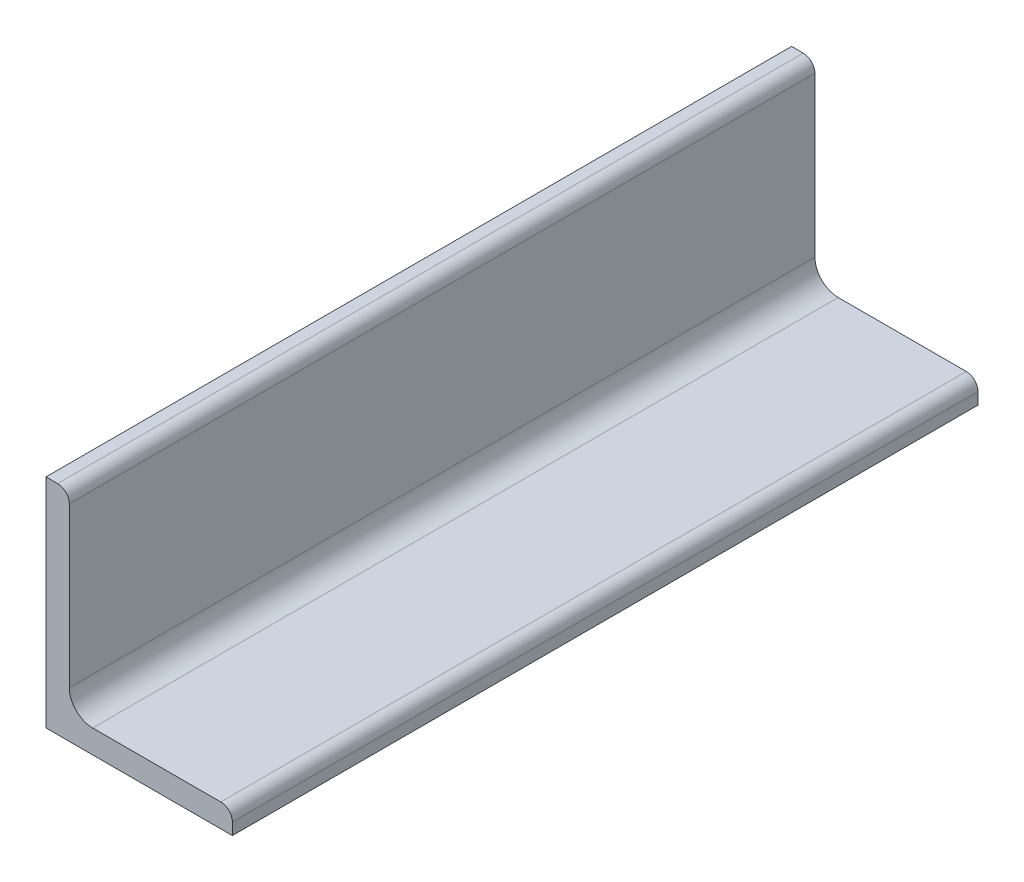
ISO-10303-21;
HEADER;
FILE_DESCRIPTION(('STEP AP214'),'2;1');
FILE_NAME('part.step','',(''),(''),'','','');
FILE_SCHEMA(('AUTOMOTIVE_DESIGN { 1 0 10303 214 1 1 1 1 }'));
ENDSEC;
DATA;
#1=APPLICATION_CONTEXT('core data for automotive mechanical design processes');
#2=APPLICATION_PROTOCOL_DEFINITION('international standard','automotive_design',2000,#1);
#3=PRODUCT_CONTEXT('',#1,'mechanical');
#4=PRODUCT('Part','Part','',(#3));
#5=PRODUCT_RELATED_PRODUCT_CATEGORY('part','',(#4));
#6=PRODUCT_DEFINITION_FORMATION('','',#4);
#7=PRODUCT_DEFINITION_CONTEXT('part definition',#1,'design');
#8=PRODUCT_DEFINITION('design','',#6,#7);
#9=PRODUCT_DEFINITION_SHAPE('','',#8);
#10=(LENGTH_UNIT() NAMED_UNIT(*) SI_UNIT(.MILLI.,.METRE.));
#11=(NAMED_UNIT(*) PLANE_ANGLE_UNIT() SI_UNIT($,.RADIAN.));
#12=(NAMED_UNIT(*) SI_UNIT($,.STERADIAN.) SOLID_ANGLE_UNIT());
#13=UNCERTAINTY_MEASURE_WITH_UNIT(LENGTH_MEASURE(1.E-05),#10,'distance_accuracy_value','');
#14=(GEOMETRIC_REPRESENTATION_CONTEXT(3) GLOBAL_UNCERTAINTY_ASSIGNED_CONTEXT((#13)) GLOBAL_UNIT_ASSIGNED_CONTEXT((#10,
#11,#12)) REPRESENTATION_CONTEXT('',''));
#15=CARTESIAN_POINT('',(0.,0.,0.));
#16=DIRECTION('',(0.,0.,1.));
#17=DIRECTION('',(1.,0.,0.));
#18=AXIS2_PLACEMENT_3D('',#15,#16,#17);
#19=CARTESIAN_POINT('',(0.490776827053332,89.7372005393545,304.8));
#20=DIRECTION('',(1.,0.,0.));
#21=DIRECTION('',(0.,0.,-1.));
#22=AXIS2_PLACEMENT_3D('',#19,#20,#21);
#23=PLANE('',#22);
#24=DIRECTION('',(0.,-1.,0.));
#25=VECTOR('',#24,1.);
#26=CARTESIAN_POINT('',(0.490776827053332,89.7372005393545,0.));
#27=LINE('',#26,#25);
#28=CARTESIAN_POINT('',(0.490776827053332,89.7372005393545,0.));
#29=VERTEX_POINT('',#28);
#30=CARTESIAN_POINT('',(0.490776827053332,0.837200539354535,0.));
#31=VERTEX_POINT('',#30);
#32=EDGE_CURVE('E135',#29,#31,#27,.T.);
#33=ORIENTED_EDGE('',*,*,#32,.T.);
#34=DIRECTION('',(0.,0.,-1.));
#35=VECTOR('',#34,1.);
#36=CARTESIAN_POINT('',(0.490776827053332,0.837200539354535,304.8));
#37=LINE('',#36,#35);
#38=CARTESIAN_POINT('',(0.490776827053332,0.837200539354535,304.8));
#39=VERTEX_POINT('',#38);
#40=EDGE_CURVE('E11',#39,#31,#37,.T.);
#41=ORIENTED_EDGE('',*,*,#40,.F.);
#42=DIRECTION('',(0.,-1.,0.));
#43=VECTOR('',#42,1.);
#44=CARTESIAN_POINT('',(0.490776827053332,89.7372005393545,304.8));
#45=LINE('',#44,#43);
#46=CARTESIAN_POINT('',(0.490776827053332,89.7372005393545,304.8));
#47=VERTEX_POINT('',#46);
#48=EDGE_CURVE('E151',#47,#39,#45,.T.);
#49=ORIENTED_EDGE('',*,*,#48,.F.);
#50=DIRECTION('',(0.,0.,-1.));
#51=VECTOR('',#50,1.);
#52=CARTESIAN_POINT('',(0.490776827053332,89.7372005393545,304.8));
#53=LINE('',#52,#51);
#54=EDGE_CURVE('E131',#47,#29,#53,.T.);
#55=ORIENTED_EDGE('',*,*,#54,.T.);
#56=EDGE_LOOP('',(#33,#41,#49,#55));
#57=FACE_BOUND('',#56,.T.);
#58=ADVANCED_FACE('F33',(#57),#23,.F.);
#59=CARTESIAN_POINT('',(0.490776827053332,0.837200539354535,304.8));
#60=DIRECTION('',(0.,1.,0.));
#61=DIRECTION('',(0.,0.,1.));
#62=AXIS2_PLACEMENT_3D('',#59,#60,#61);
#63=PLANE('',#62);
#64=DIRECTION('',(1.,0.,0.));
#65=VECTOR('',#64,1.);
#66=CARTESIAN_POINT('',(0.490776827053332,0.837200539354535,0.));
#67=LINE('',#66,#65);
#68=CARTESIAN_POINT('',(76.6907768270533,0.837200539354535,0.));
#69=VERTEX_POINT('',#68);
#70=EDGE_CURVE('E138',#31,#69,#67,.T.);
#71=ORIENTED_EDGE('',*,*,#70,.T.);
#72=DIRECTION('',(0.,0.,-1.));
#73=VECTOR('',#72,1.);
#74=CARTESIAN_POINT('',(76.6907768270533,0.837200539354535,304.8));
#75=LINE('',#74,#73);
#76=CARTESIAN_POINT('',(76.6907768270533,0.837200539354535,304.8));
#77=VERTEX_POINT('',#76);
#78=EDGE_CURVE('E41',#77,#69,#75,.T.);
#79=ORIENTED_EDGE('',*,*,#78,.F.);
#80=DIRECTION('',(1.,0.,0.));
#81=VECTOR('',#80,1.);
#82=CARTESIAN_POINT('',(0.490776827053332,0.837200539354535,304.8));
#83=LINE('',#82,#81);
#84=EDGE_CURVE('E95',#39,#77,#83,.T.);
#85=ORIENTED_EDGE('',*,*,#84,.F.);
#86=ORIENTED_EDGE('',*,*,#40,.T.);
#87=EDGE_LOOP('',(#71,#79,#85,#86));
#88=FACE_BOUND('',#87,.T.);
#89=ADVANCED_FACE('F194',(#88),#63,.F.);
#90=CARTESIAN_POINT('',(76.6907768270533,0.837200539354535,304.8));
#91=DIRECTION('',(-1.,0.,0.));
#92=DIRECTION('',(0.,0.,1.));
#93=AXIS2_PLACEMENT_3D('',#90,#91,#92);
#94=PLANE('',#93);
#95=DIRECTION('',(0.,1.,0.));
#96=VECTOR('',#95,1.);
#97=CARTESIAN_POINT('',(76.6907768270533,0.837200539354535,0.));
#98=LINE('',#97,#96);
#99=CARTESIAN_POINT('',(76.6907768270533,5.59970053935453,0.));
#100=VERTEX_POINT('',#99);
#101=EDGE_CURVE('E140',#69,#100,#98,.T.);
#102=ORIENTED_EDGE('',*,*,#101,.T.);
#103=DIRECTION('',(0.,0.,-1.));
#104=VECTOR('',#103,1.);
#105=CARTESIAN_POINT('',(76.6907768270533,5.59970053935453,304.8));
#106=LINE('',#105,#104);
#107=CARTESIAN_POINT('',(76.6907768270533,5.59970053935453,304.8));
#108=VERTEX_POINT('',#107);
#109=EDGE_CURVE('E161',#108,#100,#106,.T.);
#110=ORIENTED_EDGE('',*,*,#109,.F.);
#111=DIRECTION('',(0.,1.,0.));
#112=VECTOR('',#111,1.);
#113=CARTESIAN_POINT('',(76.6907768270533,0.837200539354535,304.8));
#114=LINE('',#113,#112);
#115=EDGE_CURVE('E169',#77,#108,#114,.T.);
#116=ORIENTED_EDGE('',*,*,#115,.F.);
#117=ORIENTED_EDGE('',*,*,#78,.T.);
#118=EDGE_LOOP('',(#102,#110,#116,#117));
#119=FACE_BOUND('',#118,.T.);
#120=ADVANCED_FACE('F167',(#119),#94,.F.);
#121=CARTESIAN_POINT('',(71.9282768270533,5.59970053935453,304.8));
#122=DIRECTION('',(0.,0.,-1.));
#123=DIRECTION('',(-1.,0.,0.));
#124=AXIS2_PLACEMENT_3D('',#121,#122,#123);
#125=CYLINDRICAL_SURFACE('',#124,4.7625);
#126=CARTESIAN_POINT('',(71.9282768270533,5.59970053935453,0.));
#127=DIRECTION('',(0.,0.,1.));
#128=DIRECTION('',(1.,0.,0.));
#129=AXIS2_PLACEMENT_3D('',#126,#127,#128);
#130=CIRCLE('',#129,4.7625);
#131=CARTESIAN_POINT('',(71.9282768270533,10.3622005393545,0.));
#132=VERTEX_POINT('',#131);
#133=EDGE_CURVE('E142',#100,#132,#130,.T.);
#134=ORIENTED_EDGE('',*,*,#133,.T.);
#135=DIRECTION('',(0.,0.,-1.));
#136=VECTOR('',#135,1.);
#137=CARTESIAN_POINT('',(71.9282768270533,10.3622005393545,304.8));
#138=LINE('',#137,#136);
#139=CARTESIAN_POINT('',(71.9282768270533,10.3622005393545,304.8));
#140=VERTEX_POINT('',#139);
#141=EDGE_CURVE('E158',#140,#132,#138,.T.);
#142=ORIENTED_EDGE('',*,*,#141,.F.);
#143=CARTESIAN_POINT('',(71.9282768270533,5.59970053935453,304.8));
#144=DIRECTION('',(0.,0.,1.));
#145=DIRECTION('',(1.,0.,0.));
#146=AXIS2_PLACEMENT_3D('',#143,#144,#145);
#147=CIRCLE('',#146,4.7625);
#148=EDGE_CURVE('E185',#108,#140,#147,.T.);
#149=ORIENTED_EDGE('',*,*,#148,.F.);
#150=ORIENTED_EDGE('',*,*,#109,.T.);
#151=EDGE_LOOP('',(#134,#142,#149,#150));
#152=FACE_BOUND('',#151,.T.);
#153=ADVANCED_FACE('F178',(#152),#125,.T.);
#154=CARTESIAN_POINT('',(71.9282768270533,10.3622005393545,304.8));
#155=DIRECTION('',(0.,-1.,0.));
#156=DIRECTION('',(0.,0.,-1.));
#157=AXIS2_PLACEMENT_3D('',#154,#155,#156);
#158=PLANE('',#157);
#159=DIRECTION('',(-1.,0.,0.));
#160=VECTOR('',#159,1.);
#161=CARTESIAN_POINT('',(71.9282768270533,10.3622005393545,0.));
#162=LINE('',#161,#160);
#163=CARTESIAN_POINT('',(19.5407768270533,10.3622005393545,0.));
#164=VERTEX_POINT('',#163);
#165=EDGE_CURVE('E144',#132,#164,#162,.T.);
#166=ORIENTED_EDGE('',*,*,#165,.T.);
#167=DIRECTION('',(0.,0.,-1.));
#168=VECTOR('',#167,1.);
#169=CARTESIAN_POINT('',(19.5407768270533,10.3622005393545,304.8));
#170=LINE('',#169,#168);
#171=CARTESIAN_POINT('',(19.5407768270533,10.3622005393545,304.8));
#172=VERTEX_POINT('',#171);
#173=EDGE_CURVE('E155',#172,#164,#170,.T.);
#174=ORIENTED_EDGE('',*,*,#173,.F.);
#175=DIRECTION('',(-1.,0.,0.));
#176=VECTOR('',#175,1.);
#177=CARTESIAN_POINT('',(71.9282768270533,10.3622005393545,304.8));
#178=LINE('',#177,#176);
#179=EDGE_CURVE('E184',#140,#172,#178,.T.);
#180=ORIENTED_EDGE('',*,*,#179,.F.);
#181=ORIENTED_EDGE('',*,*,#141,.T.);
#182=EDGE_LOOP('',(#166,#174,#180,#181));
#183=FACE_BOUND('',#182,.T.);
#184=ADVANCED_FACE('F182',(#183),#158,.F.);
#185=CARTESIAN_POINT('',(19.5407768270533,19.8872005393545,304.8));
#186=DIRECTION('',(0.,0.,-1.));
#187=DIRECTION('',(-1.,0.,0.));
#188=AXIS2_PLACEMENT_3D('',#185,#186,#187);
#189=CYLINDRICAL_SURFACE('',#188,9.52499999999999);
#190=CARTESIAN_POINT('',(19.5407768270533,19.8872005393545,0.));
#191=DIRECTION('',(0.,0.,-1.));
#192=DIRECTION('',(1.,0.,0.));
#193=AXIS2_PLACEMENT_3D('',#190,#191,#192);
#194=CIRCLE('',#193,9.52499999999999);
#195=CARTESIAN_POINT('',(10.0157768270533,19.8872005393545,0.));
#196=VERTEX_POINT('',#195);
#197=EDGE_CURVE('E146',#164,#196,#194,.T.);
#198=ORIENTED_EDGE('',*,*,#197,.T.);
#199=DIRECTION('',(0.,0.,-1.));
#200=VECTOR('',#199,1.);
#201=CARTESIAN_POINT('',(10.0157768270533,19.8872005393545,304.8));
#202=LINE('',#201,#200);
#203=CARTESIAN_POINT('',(10.0157768270533,19.8872005393545,304.8));
#204=VERTEX_POINT('',#203);
#205=EDGE_CURVE('E126',#204,#196,#202,.T.);
#206=ORIENTED_EDGE('',*,*,#205,.F.);
#207=CARTESIAN_POINT('',(19.5407768270533,19.8872005393545,304.8));
#208=DIRECTION('',(0.,0.,-1.));
#209=DIRECTION('',(1.,0.,0.));
#210=AXIS2_PLACEMENT_3D('',#207,#208,#209);
#211=CIRCLE('',#210,9.52499999999999);
#212=EDGE_CURVE('E117',#172,#204,#211,.T.);
#213=ORIENTED_EDGE('',*,*,#212,.F.);
#214=ORIENTED_EDGE('',*,*,#173,.T.);
#215=EDGE_LOOP('',(#198,#206,#213,#214));
#216=FACE_BOUND('',#215,.T.);
#217=ADVANCED_FACE('F206',(#216),#189,.F.);
#218=CARTESIAN_POINT('',(10.0157768270533,19.8872005393545,304.8));
#219=DIRECTION('',(-1.,0.,0.));
#220=DIRECTION('',(0.,0.,1.));
#221=AXIS2_PLACEMENT_3D('',#218,#219,#220);
#222=PLANE('',#221);
#223=DIRECTION('',(0.,1.,0.));
#224=VECTOR('',#223,1.);
#225=CARTESIAN_POINT('',(10.0157768270533,19.8872005393545,0.));
#226=LINE('',#225,#224);
#227=CARTESIAN_POINT('',(10.0157768270533,84.9747005393545,0.));
#228=VERTEX_POINT('',#227);
#229=EDGE_CURVE('E125',#196,#228,#226,.T.);
#230=ORIENTED_EDGE('',*,*,#229,.T.);
#231=DIRECTION('',(0.,0.,-1.));
#232=VECTOR('',#231,1.);
#233=CARTESIAN_POINT('',(10.0157768270533,84.9747005393545,304.8));
#234=LINE('',#233,#232);
#235=CARTESIAN_POINT('',(10.0157768270533,84.9747005393545,304.8));
#236=VERTEX_POINT('',#235);
#237=EDGE_CURVE('E122',#236,#228,#234,.T.);
#238=ORIENTED_EDGE('',*,*,#237,.F.);
#239=DIRECTION('',(0.,1.,0.));
#240=VECTOR('',#239,1.);
#241=CARTESIAN_POINT('',(10.0157768270533,19.8872005393545,304.8));
#242=LINE('',#241,#240);
#243=EDGE_CURVE('E111',#204,#236,#242,.T.);
#244=ORIENTED_EDGE('',*,*,#243,.F.);
#245=ORIENTED_EDGE('',*,*,#205,.T.);
#246=EDGE_LOOP('',(#230,#238,#244,#245));
#247=FACE_BOUND('',#246,.T.);
#248=ADVANCED_FACE('F123',(#247),#222,.F.);
#249=CARTESIAN_POINT('',(5.25327682705333,84.9747005393545,304.8));
#250=DIRECTION('',(0.,0.,-1.));
#251=DIRECTION('',(-1.,0.,0.));
#252=AXIS2_PLACEMENT_3D('',#249,#250,#251);
#253=CYLINDRICAL_SURFACE('',#252,4.7625);
#254=CARTESIAN_POINT('',(5.25327682705333,84.9747005393545,0.));
#255=DIRECTION('',(0.,0.,1.));
#256=DIRECTION('',(1.,0.,0.));
#257=AXIS2_PLACEMENT_3D('',#254,#255,#256);
#258=CIRCLE('',#257,4.7625);
#259=CARTESIAN_POINT('',(5.25327682705333,89.7372005393545,0.));
#260=VERTEX_POINT('',#259);
#261=EDGE_CURVE('E81',#228,#260,#258,.T.);
#262=ORIENTED_EDGE('',*,*,#261,.T.);
#263=DIRECTION('',(0.,0.,-1.));
#264=VECTOR('',#263,1.);
#265=CARTESIAN_POINT('',(5.25327682705333,89.7372005393545,304.8));
#266=LINE('',#265,#264);
#267=CARTESIAN_POINT('',(5.25327682705333,89.7372005393545,304.8));
#268=VERTEX_POINT('',#267);
#269=EDGE_CURVE('E127',#268,#260,#266,.T.);
#270=ORIENTED_EDGE('',*,*,#269,.F.);
#271=CARTESIAN_POINT('',(5.25327682705333,84.9747005393545,304.8));
#272=DIRECTION('',(0.,0.,1.));
#273=DIRECTION('',(1.,0.,0.));
#274=AXIS2_PLACEMENT_3D('',#271,#272,#273);
#275=CIRCLE('',#274,4.7625);
#276=EDGE_CURVE('E115',#236,#268,#275,.T.);
#277=ORIENTED_EDGE('',*,*,#276,.F.);
#278=ORIENTED_EDGE('',*,*,#237,.T.);
#279=EDGE_LOOP('',(#262,#270,#277,#278));
#280=FACE_BOUND('',#279,.T.);
#281=ADVANCED_FACE('F129',(#280),#253,.T.);
#282=CARTESIAN_POINT('',(5.25327682705333,89.7372005393545,304.8));
#283=DIRECTION('',(0.,-1.,0.));
#284=DIRECTION('',(0.,0.,-1.));
#285=AXIS2_PLACEMENT_3D('',#282,#283,#284);
#286=PLANE('',#285);
#287=DIRECTION('',(-1.,0.,0.));
#288=VECTOR('',#287,1.);
#289=CARTESIAN_POINT('',(5.25327682705333,89.7372005393545,0.));
#290=LINE('',#289,#288);
#291=EDGE_CURVE('E87',#260,#29,#290,.T.);
#292=ORIENTED_EDGE('',*,*,#291,.T.);
#293=ORIENTED_EDGE('',*,*,#54,.F.);
#294=DIRECTION('',(-1.,0.,0.));
#295=VECTOR('',#294,1.);
#296=CARTESIAN_POINT('',(5.25327682705333,89.7372005393545,304.8));
#297=LINE('',#296,#295);
#298=EDGE_CURVE('E49',#268,#47,#297,.T.);
#299=ORIENTED_EDGE('',*,*,#298,.F.);
#300=ORIENTED_EDGE('',*,*,#269,.T.);
#301=EDGE_LOOP('',(#292,#293,#299,#300));
#302=FACE_BOUND('',#301,.T.);
#303=ADVANCED_FACE('F214',(#302),#286,.F.);
#304=CARTESIAN_POINT('',(71.9282768270533,5.59970053935453,304.8));
#305=DIRECTION('',(0.,0.,1.));
#306=DIRECTION('',(1.,0.,0.));
#307=AXIS2_PLACEMENT_3D('',#304,#305,#306);
#308=PLANE('',#307);
#309=ORIENTED_EDGE('',*,*,#48,.T.);
#310=ORIENTED_EDGE('',*,*,#84,.T.);
#311=ORIENTED_EDGE('',*,*,#115,.T.);
#312=ORIENTED_EDGE('',*,*,#148,.T.);
#313=ORIENTED_EDGE('',*,*,#179,.T.);
#314=ORIENTED_EDGE('',*,*,#212,.T.);
#315=ORIENTED_EDGE('',*,*,#243,.T.);
#316=ORIENTED_EDGE('',*,*,#276,.T.);
#317=ORIENTED_EDGE('',*,*,#298,.T.);
#318=EDGE_LOOP('',(#309,#310,#311,#312,#313,#314,#315,#316,#317));
#319=FACE_BOUND('',#318,.T.);
#320=ADVANCED_FACE('F113',(#319),#308,.T.);
#321=CARTESIAN_POINT('',(71.9282768270533,5.59970053935453,0.));
#322=DIRECTION('',(0.,0.,1.));
#323=DIRECTION('',(1.,0.,0.));
#324=AXIS2_PLACEMENT_3D('',#321,#322,#323);
#325=PLANE('',#324);
#326=ORIENTED_EDGE('',*,*,#32,.F.);
#327=ORIENTED_EDGE('',*,*,#291,.F.);
#328=ORIENTED_EDGE('',*,*,#261,.F.);
#329=ORIENTED_EDGE('',*,*,#229,.F.);
#330=ORIENTED_EDGE('',*,*,#197,.F.);
#331=ORIENTED_EDGE('',*,*,#165,.F.);
#332=ORIENTED_EDGE('',*,*,#133,.F.);
#333=ORIENTED_EDGE('',*,*,#101,.F.);
#334=ORIENTED_EDGE('',*,*,#70,.F.);
#335=EDGE_LOOP('',(#326,#327,#328,#329,#330,#331,#332,#333,#334));
#336=FACE_BOUND('',#335,.T.);
#337=ADVANCED_FACE('F173',(#336),#325,.F.);
#338=CLOSED_SHELL('',(#58,#89,#120,#153,#184,#217,#248,#281,#303,#320,#337));
#339=MANIFOLD_SOLID_BREP('B2',#338);
#340=ADVANCED_BREP_SHAPE_REPRESENTATION('',(#18,#339),#14);
#341=SHAPE_DEFINITION_REPRESENTATION(#9,#340);
ENDSEC;
END-ISO-10303-21;
